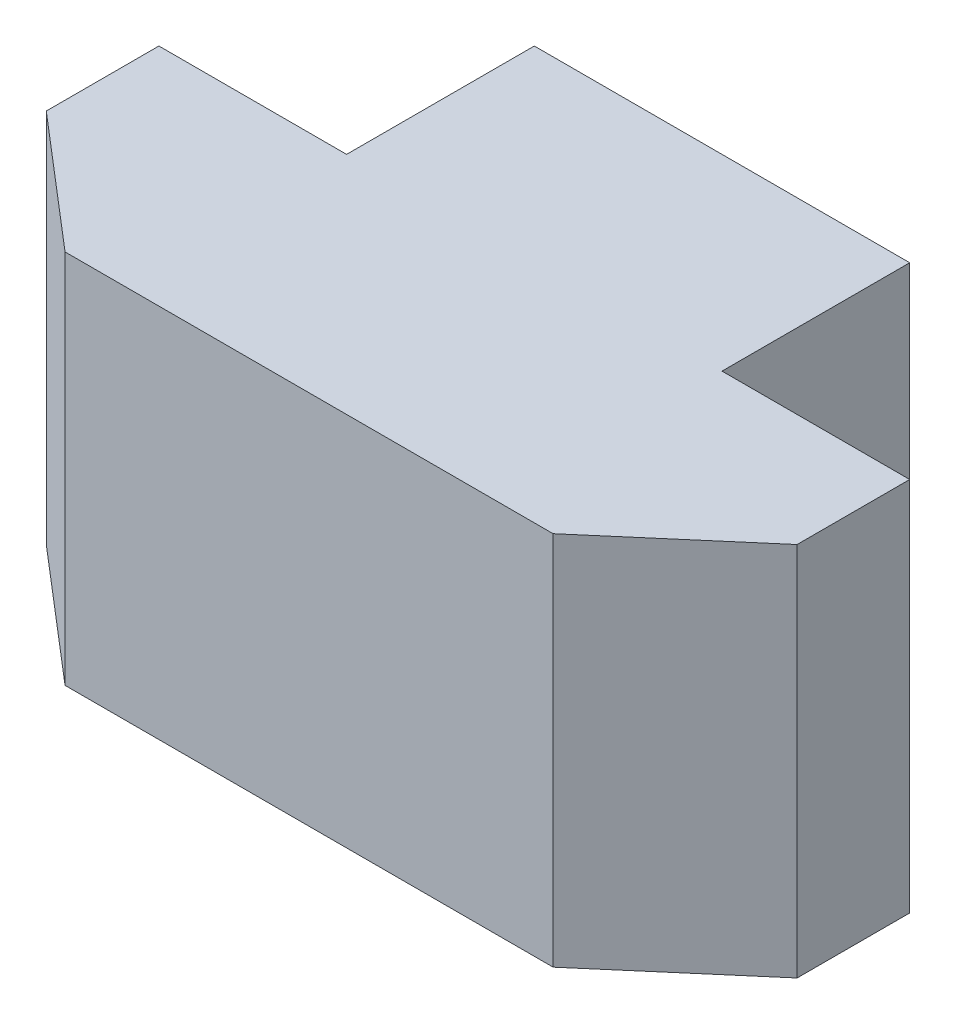
ISO-10303-21;
HEADER;
FILE_DESCRIPTION(('STEP AP214'),'2;1');
FILE_NAME('part.step','',(''),(''),'','','');
FILE_SCHEMA(('AUTOMOTIVE_DESIGN { 1 0 10303 214 1 1 1 1 }'));
ENDSEC;
DATA;
#1=APPLICATION_CONTEXT('core data for automotive mechanical design processes');
#2=APPLICATION_PROTOCOL_DEFINITION('international standard','automotive_design',2000,#1);
#3=PRODUCT_CONTEXT('',#1,'mechanical');
#4=PRODUCT('Part','Part','',(#3));
#5=PRODUCT_RELATED_PRODUCT_CATEGORY('part','',(#4));
#6=PRODUCT_DEFINITION_FORMATION('','',#4);
#7=PRODUCT_DEFINITION_CONTEXT('part definition',#1,'design');
#8=PRODUCT_DEFINITION('design','',#6,#7);
#9=PRODUCT_DEFINITION_SHAPE('','',#8);
#10=(LENGTH_UNIT() NAMED_UNIT(*) SI_UNIT(.MILLI.,.METRE.));
#11=(NAMED_UNIT(*) PLANE_ANGLE_UNIT() SI_UNIT($,.RADIAN.));
#12=(NAMED_UNIT(*) SI_UNIT($,.STERADIAN.) SOLID_ANGLE_UNIT());
#13=UNCERTAINTY_MEASURE_WITH_UNIT(LENGTH_MEASURE(1.E-05),#10,'distance_accuracy_value','');
#14=(GEOMETRIC_REPRESENTATION_CONTEXT(3) GLOBAL_UNCERTAINTY_ASSIGNED_CONTEXT((#13)) GLOBAL_UNIT_ASSIGNED_CONTEXT((#10,
#11,#12)) REPRESENTATION_CONTEXT('',''));
#15=CARTESIAN_POINT('',(0.,0.,0.));
#16=DIRECTION('',(0.,0.,1.));
#17=DIRECTION('',(1.,0.,0.));
#18=AXIS2_PLACEMENT_3D('',#15,#16,#17);
#19=CARTESIAN_POINT('',(-7.67083154247305,5.,-1.25324339707883));
#20=DIRECTION('',(1.,0.,0.));
#21=DIRECTION('',(0.,0.,-1.));
#22=AXIS2_PLACEMENT_3D('',#19,#20,#21);
#23=PLANE('',#22);
#24=DIRECTION('',(0.,0.,1.));
#25=VECTOR('',#24,1.);
#26=CARTESIAN_POINT('',(-7.67083154247305,-5.,-1.25324339707883));
#27=LINE('',#26,#25);
#28=CARTESIAN_POINT('',(-7.67083154247305,-5.,-1.25324339707883));
#29=VERTEX_POINT('',#28);
#30=CARTESIAN_POINT('',(-7.67083154247305,-5.,3.74675660292117));
#31=VERTEX_POINT('',#30);
#32=EDGE_CURVE('E152',#29,#31,#27,.T.);
#33=ORIENTED_EDGE('',*,*,#32,.T.);
#34=DIRECTION('',(0.,-1.,0.));
#35=VECTOR('',#34,1.);
#36=CARTESIAN_POINT('',(-7.67083154247305,5.,3.74675660292117));
#37=LINE('',#36,#35);
#38=CARTESIAN_POINT('',(-7.67083154247305,5.,3.74675660292117));
#39=VERTEX_POINT('',#38);
#40=EDGE_CURVE('E11',#39,#31,#37,.T.);
#41=ORIENTED_EDGE('',*,*,#40,.F.);
#42=DIRECTION('',(0.,0.,1.));
#43=VECTOR('',#42,1.);
#44=CARTESIAN_POINT('',(-7.67083154247305,5.,-1.25324339707883));
#45=LINE('',#44,#43);
#46=CARTESIAN_POINT('',(-7.67083154247305,5.,-1.25324339707883));
#47=VERTEX_POINT('',#46);
#48=EDGE_CURVE('E180',#47,#39,#45,.T.);
#49=ORIENTED_EDGE('',*,*,#48,.F.);
#50=DIRECTION('',(0.,-1.,0.));
#51=VECTOR('',#50,1.);
#52=CARTESIAN_POINT('',(-7.67083154247305,5.,-1.25324339707883));
#53=LINE('',#52,#51);
#54=EDGE_CURVE('E148',#47,#29,#53,.T.);
#55=ORIENTED_EDGE('',*,*,#54,.T.);
#56=EDGE_LOOP('',(#33,#41,#49,#55));
#57=FACE_BOUND('',#56,.T.);
#58=ADVANCED_FACE('F39',(#57),#23,.F.);
#59=CARTESIAN_POINT('',(-7.67083154247305,5.,3.74675660292117));
#60=DIRECTION('',(0.,0.,1.));
#61=DIRECTION('',(1.,0.,0.));
#62=AXIS2_PLACEMENT_3D('',#59,#60,#61);
#63=PLANE('',#62);
#64=DIRECTION('',(-1.,0.,0.));
#65=VECTOR('',#64,1.);
#66=CARTESIAN_POINT('',(-7.67083154247305,-5.,3.74675660292117));
#67=LINE('',#66,#65);
#68=CARTESIAN_POINT('',(-12.670831542473,-5.,3.74675660292117));
#69=VERTEX_POINT('',#68);
#70=EDGE_CURVE('E156',#31,#69,#67,.T.);
#71=ORIENTED_EDGE('',*,*,#70,.T.);
#72=DIRECTION('',(0.,-1.,0.));
#73=VECTOR('',#72,1.);
#74=CARTESIAN_POINT('',(-12.670831542473,5.,3.74675660292117));
#75=LINE('',#74,#73);
#76=CARTESIAN_POINT('',(-12.670831542473,5.,3.74675660292117));
#77=VERTEX_POINT('',#76);
#78=EDGE_CURVE('E48',#77,#69,#75,.T.);
#79=ORIENTED_EDGE('',*,*,#78,.F.);
#80=DIRECTION('',(-1.,0.,0.));
#81=VECTOR('',#80,1.);
#82=CARTESIAN_POINT('',(-7.67083154247305,5.,3.74675660292117));
#83=LINE('',#82,#81);
#84=EDGE_CURVE('E105',#39,#77,#83,.T.);
#85=ORIENTED_EDGE('',*,*,#84,.F.);
#86=ORIENTED_EDGE('',*,*,#40,.T.);
#87=EDGE_LOOP('',(#71,#79,#85,#86));
#88=FACE_BOUND('',#87,.T.);
#89=ADVANCED_FACE('F244',(#88),#63,.F.);
#90=CARTESIAN_POINT('',(-12.670831542473,5.,3.74675660292117));
#91=DIRECTION('',(1.,0.,0.));
#92=DIRECTION('',(0.,0.,-1.));
#93=AXIS2_PLACEMENT_3D('',#90,#91,#92);
#94=PLANE('',#93);
#95=DIRECTION('',(0.,0.,1.));
#96=VECTOR('',#95,1.);
#97=CARTESIAN_POINT('',(-12.670831542473,-5.,3.74675660292117));
#98=LINE('',#97,#96);
#99=CARTESIAN_POINT('',(-12.670831542473,-5.,6.74675660292117));
#100=VERTEX_POINT('',#99);
#101=EDGE_CURVE('E159',#69,#100,#98,.T.);
#102=ORIENTED_EDGE('',*,*,#101,.T.);
#103=DIRECTION('',(0.,-1.,0.));
#104=VECTOR('',#103,1.);
#105=CARTESIAN_POINT('',(-12.670831542473,5.,6.74675660292117));
#106=LINE('',#105,#104);
#107=CARTESIAN_POINT('',(-12.670831542473,5.,6.74675660292117));
#108=VERTEX_POINT('',#107);
#109=EDGE_CURVE('E199',#108,#100,#106,.T.);
#110=ORIENTED_EDGE('',*,*,#109,.F.);
#111=DIRECTION('',(0.,0.,1.));
#112=VECTOR('',#111,1.);
#113=CARTESIAN_POINT('',(-12.670831542473,5.,3.74675660292117));
#114=LINE('',#113,#112);
#115=EDGE_CURVE('E209',#77,#108,#114,.T.);
#116=ORIENTED_EDGE('',*,*,#115,.F.);
#117=ORIENTED_EDGE('',*,*,#78,.T.);
#118=EDGE_LOOP('',(#102,#110,#116,#117));
#119=FACE_BOUND('',#118,.T.);
#120=ADVANCED_FACE('F207',(#119),#94,.F.);
#121=CARTESIAN_POINT('',(-12.670831542473,5.,6.74675660292117));
#122=DIRECTION('',(0.650791373455969,0.,-0.759256602365297));
#123=DIRECTION('',(-0.759256602365297,0.,-0.650791373455969));
#124=AXIS2_PLACEMENT_3D('',#121,#122,#123);
#125=PLANE('',#124);
#126=DIRECTION('',(0.759256602365297,0.,0.650791373455969));
#127=VECTOR('',#126,1.);
#128=CARTESIAN_POINT('',(-12.670831542473,-5.,6.74675660292117));
#129=LINE('',#128,#127);
#130=CARTESIAN_POINT('',(-9.17083154247305,-5.,9.74675660292117));
#131=VERTEX_POINT('',#130);
#132=EDGE_CURVE('E162',#100,#131,#129,.T.);
#133=ORIENTED_EDGE('',*,*,#132,.T.);
#134=DIRECTION('',(0.,-1.,0.));
#135=VECTOR('',#134,1.);
#136=CARTESIAN_POINT('',(-9.17083154247305,5.,9.74675660292117));
#137=LINE('',#136,#135);
#138=CARTESIAN_POINT('',(-9.17083154247305,5.,9.74675660292117));
#139=VERTEX_POINT('',#138);
#140=EDGE_CURVE('E195',#139,#131,#137,.T.);
#141=ORIENTED_EDGE('',*,*,#140,.F.);
#142=DIRECTION('',(0.759256602365297,0.,0.650791373455969));
#143=VECTOR('',#142,1.);
#144=CARTESIAN_POINT('',(-12.670831542473,5.,6.74675660292117));
#145=LINE('',#144,#143);
#146=EDGE_CURVE('E228',#108,#139,#145,.T.);
#147=ORIENTED_EDGE('',*,*,#146,.F.);
#148=ORIENTED_EDGE('',*,*,#109,.T.);
#149=EDGE_LOOP('',(#133,#141,#147,#148));
#150=FACE_BOUND('',#149,.T.);
#151=ADVANCED_FACE('F218',(#150),#125,.F.);
#152=CARTESIAN_POINT('',(-9.17083154247305,5.,9.74675660292117));
#153=DIRECTION('',(0.,0.,-1.));
#154=DIRECTION('',(-1.,0.,0.));
#155=AXIS2_PLACEMENT_3D('',#152,#153,#154);
#156=PLANE('',#155);
#157=DIRECTION('',(1.,0.,0.));
#158=VECTOR('',#157,1.);
#159=CARTESIAN_POINT('',(-9.17083154247305,-5.,9.74675660292117));
#160=LINE('',#159,#158);
#161=CARTESIAN_POINT('',(3.82916845752695,-5.,9.74675660292117));
#162=VERTEX_POINT('',#161);
#163=EDGE_CURVE('E165',#131,#162,#160,.T.);
#164=ORIENTED_EDGE('',*,*,#163,.T.);
#165=DIRECTION('',(0.,-1.,0.));
#166=VECTOR('',#165,1.);
#167=CARTESIAN_POINT('',(3.82916845752695,5.,9.74675660292117));
#168=LINE('',#167,#166);
#169=CARTESIAN_POINT('',(3.82916845752695,5.,9.74675660292117));
#170=VERTEX_POINT('',#169);
#171=EDGE_CURVE('E191',#170,#162,#168,.T.);
#172=ORIENTED_EDGE('',*,*,#171,.F.);
#173=DIRECTION('',(1.,0.,0.));
#174=VECTOR('',#173,1.);
#175=CARTESIAN_POINT('',(-9.17083154247305,5.,9.74675660292117));
#176=LINE('',#175,#174);
#177=EDGE_CURVE('E224',#139,#170,#176,.T.);
#178=ORIENTED_EDGE('',*,*,#177,.F.);
#179=ORIENTED_EDGE('',*,*,#140,.T.);
#180=EDGE_LOOP('',(#164,#172,#178,#179));
#181=FACE_BOUND('',#180,.T.);
#182=ADVANCED_FACE('F222',(#181),#156,.F.);
#183=CARTESIAN_POINT('',(7.32916845752695,5.,6.74675660292117));
#184=DIRECTION('',(-0.650791373455968,0.,-0.759256602365297));
#185=DIRECTION('',(-0.759256602365297,0.,0.650791373455968));
#186=AXIS2_PLACEMENT_3D('',#183,#184,#185);
#187=PLANE('',#186);
#188=DIRECTION('',(0.759256602365297,0.,-0.650791373455968));
#189=VECTOR('',#188,1.);
#190=CARTESIAN_POINT('',(7.32916845752695,-5.,6.74675660292117));
#191=LINE('',#190,#189);
#192=CARTESIAN_POINT('',(7.32916845752695,-5.,6.74675660292117));
#193=VERTEX_POINT('',#192);
#194=EDGE_CURVE('E168',#162,#193,#191,.T.);
#195=ORIENTED_EDGE('',*,*,#194,.T.);
#196=DIRECTION('',(0.,-1.,0.));
#197=VECTOR('',#196,1.);
#198=CARTESIAN_POINT('',(7.32916845752695,5.,6.74675660292117));
#199=LINE('',#198,#197);
#200=CARTESIAN_POINT('',(7.32916845752695,5.,6.74675660292117));
#201=VERTEX_POINT('',#200);
#202=EDGE_CURVE('E187',#201,#193,#199,.T.);
#203=ORIENTED_EDGE('',*,*,#202,.F.);
#204=DIRECTION('',(0.759256602365297,0.,-0.650791373455968));
#205=VECTOR('',#204,1.);
#206=CARTESIAN_POINT('',(7.32916845752695,5.,6.74675660292117));
#207=LINE('',#206,#205);
#208=EDGE_CURVE('E227',#170,#201,#207,.T.);
#209=ORIENTED_EDGE('',*,*,#208,.F.);
#210=ORIENTED_EDGE('',*,*,#171,.T.);
#211=EDGE_LOOP('',(#195,#203,#209,#210));
#212=FACE_BOUND('',#211,.T.);
#213=ADVANCED_FACE('F256',(#212),#187,.F.);
#214=CARTESIAN_POINT('',(7.32916845752695,5.,3.74675660292117));
#215=DIRECTION('',(-1.,0.,0.));
#216=DIRECTION('',(0.,0.,1.));
#217=AXIS2_PLACEMENT_3D('',#214,#215,#216);
#218=PLANE('',#217);
#219=DIRECTION('',(0.,0.,-1.));
#220=VECTOR('',#219,1.);
#221=CARTESIAN_POINT('',(7.32916845752695,-5.,3.74675660292117));
#222=LINE('',#221,#220);
#223=CARTESIAN_POINT('',(7.32916845752695,-5.,3.74675660292117));
#224=VERTEX_POINT('',#223);
#225=EDGE_CURVE('E171',#193,#224,#222,.T.);
#226=ORIENTED_EDGE('',*,*,#225,.T.);
#227=DIRECTION('',(0.,-1.,0.));
#228=VECTOR('',#227,1.);
#229=CARTESIAN_POINT('',(7.32916845752695,5.,3.74675660292117));
#230=LINE('',#229,#228);
#231=CARTESIAN_POINT('',(7.32916845752695,5.,3.74675660292117));
#232=VERTEX_POINT('',#231);
#233=EDGE_CURVE('E141',#232,#224,#230,.T.);
#234=ORIENTED_EDGE('',*,*,#233,.F.);
#235=DIRECTION('',(0.,0.,-1.));
#236=VECTOR('',#235,1.);
#237=CARTESIAN_POINT('',(7.32916845752695,5.,3.74675660292117));
#238=LINE('',#237,#236);
#239=EDGE_CURVE('E130',#201,#232,#238,.T.);
#240=ORIENTED_EDGE('',*,*,#239,.F.);
#241=ORIENTED_EDGE('',*,*,#202,.T.);
#242=EDGE_LOOP('',(#226,#234,#240,#241));
#243=FACE_BOUND('',#242,.T.);
#244=ADVANCED_FACE('F259',(#243),#218,.F.);
#245=CARTESIAN_POINT('',(2.32916845752695,5.,3.74675660292117));
#246=DIRECTION('',(0.,0.,1.));
#247=DIRECTION('',(1.,0.,0.));
#248=AXIS2_PLACEMENT_3D('',#245,#246,#247);
#249=PLANE('',#248);
#250=DIRECTION('',(-1.,0.,0.));
#251=VECTOR('',#250,1.);
#252=CARTESIAN_POINT('',(2.32916845752695,-5.,3.74675660292117));
#253=LINE('',#252,#251);
#254=CARTESIAN_POINT('',(2.32916845752695,-5.,3.74675660292117));
#255=VERTEX_POINT('',#254);
#256=EDGE_CURVE('E139',#224,#255,#253,.T.);
#257=ORIENTED_EDGE('',*,*,#256,.T.);
#258=DIRECTION('',(0.,-1.,0.));
#259=VECTOR('',#258,1.);
#260=CARTESIAN_POINT('',(2.32916845752695,5.,3.74675660292117));
#261=LINE('',#260,#259);
#262=CARTESIAN_POINT('',(2.32916845752695,5.,3.74675660292117));
#263=VERTEX_POINT('',#262);
#264=EDGE_CURVE('E136',#263,#255,#261,.T.);
#265=ORIENTED_EDGE('',*,*,#264,.F.);
#266=DIRECTION('',(-1.,0.,0.));
#267=VECTOR('',#266,1.);
#268=CARTESIAN_POINT('',(2.32916845752695,5.,3.74675660292117));
#269=LINE('',#268,#267);
#270=EDGE_CURVE('E124',#232,#263,#269,.T.);
#271=ORIENTED_EDGE('',*,*,#270,.F.);
#272=ORIENTED_EDGE('',*,*,#233,.T.);
#273=EDGE_LOOP('',(#257,#265,#271,#272));
#274=FACE_BOUND('',#273,.T.);
#275=ADVANCED_FACE('F137',(#274),#249,.F.);
#276=CARTESIAN_POINT('',(2.32916845752695,5.,-1.25324339707883));
#277=DIRECTION('',(-1.,0.,0.));
#278=DIRECTION('',(0.,0.,1.));
#279=AXIS2_PLACEMENT_3D('',#276,#277,#278);
#280=PLANE('',#279);
#281=DIRECTION('',(0.,0.,-1.));
#282=VECTOR('',#281,1.);
#283=CARTESIAN_POINT('',(2.32916845752695,-5.,-1.25324339707883));
#284=LINE('',#283,#282);
#285=CARTESIAN_POINT('',(2.32916845752695,-5.,-1.25324339707883));
#286=VERTEX_POINT('',#285);
#287=EDGE_CURVE('E91',#255,#286,#284,.T.);
#288=ORIENTED_EDGE('',*,*,#287,.T.);
#289=DIRECTION('',(0.,-1.,0.));
#290=VECTOR('',#289,1.);
#291=CARTESIAN_POINT('',(2.32916845752695,5.,-1.25324339707883));
#292=LINE('',#291,#290);
#293=CARTESIAN_POINT('',(2.32916845752695,5.,-1.25324339707883));
#294=VERTEX_POINT('',#293);
#295=EDGE_CURVE('E142',#294,#286,#292,.T.);
#296=ORIENTED_EDGE('',*,*,#295,.F.);
#297=DIRECTION('',(0.,0.,-1.));
#298=VECTOR('',#297,1.);
#299=CARTESIAN_POINT('',(2.32916845752695,5.,-1.25324339707883));
#300=LINE('',#299,#298);
#301=EDGE_CURVE('E128',#263,#294,#300,.T.);
#302=ORIENTED_EDGE('',*,*,#301,.F.);
#303=ORIENTED_EDGE('',*,*,#264,.T.);
#304=EDGE_LOOP('',(#288,#296,#302,#303));
#305=FACE_BOUND('',#304,.T.);
#306=ADVANCED_FACE('F144',(#305),#280,.F.);
#307=CARTESIAN_POINT('',(-7.67083154247305,5.,-1.25324339707883));
#308=DIRECTION('',(0.,0.,1.));
#309=DIRECTION('',(1.,0.,0.));
#310=AXIS2_PLACEMENT_3D('',#307,#308,#309);
#311=PLANE('',#310);
#312=DIRECTION('',(-1.,0.,0.));
#313=VECTOR('',#312,1.);
#314=CARTESIAN_POINT('',(-7.67083154247305,-5.,-1.25324339707883));
#315=LINE('',#314,#313);
#316=EDGE_CURVE('E97',#286,#29,#315,.T.);
#317=ORIENTED_EDGE('',*,*,#316,.T.);
#318=ORIENTED_EDGE('',*,*,#54,.F.);
#319=DIRECTION('',(-1.,0.,0.));
#320=VECTOR('',#319,1.);
#321=CARTESIAN_POINT('',(-7.67083154247305,5.,-1.25324339707883));
#322=LINE('',#321,#320);
#323=EDGE_CURVE('E56',#294,#47,#322,.T.);
#324=ORIENTED_EDGE('',*,*,#323,.F.);
#325=ORIENTED_EDGE('',*,*,#295,.T.);
#326=EDGE_LOOP('',(#317,#318,#324,#325));
#327=FACE_BOUND('',#326,.T.);
#328=ADVANCED_FACE('F268',(#327),#311,.F.);
#329=CARTESIAN_POINT('',(0.,5.,0.));
#330=DIRECTION('',(0.,-1.,0.));
#331=DIRECTION('',(0.,0.,-1.));
#332=AXIS2_PLACEMENT_3D('',#329,#330,#331);
#333=PLANE('',#332);
#334=ORIENTED_EDGE('',*,*,#48,.T.);
#335=ORIENTED_EDGE('',*,*,#84,.T.);
#336=ORIENTED_EDGE('',*,*,#115,.T.);
#337=ORIENTED_EDGE('',*,*,#146,.T.);
#338=ORIENTED_EDGE('',*,*,#177,.T.);
#339=ORIENTED_EDGE('',*,*,#208,.T.);
#340=ORIENTED_EDGE('',*,*,#239,.T.);
#341=ORIENTED_EDGE('',*,*,#270,.T.);
#342=ORIENTED_EDGE('',*,*,#301,.T.);
#343=ORIENTED_EDGE('',*,*,#323,.T.);
#344=EDGE_LOOP('',(#334,#335,#336,#337,#338,#339,#340,#341,#342,#343));
#345=FACE_BOUND('',#344,.T.);
#346=ADVANCED_FACE('F126',(#345),#333,.F.);
#347=CARTESIAN_POINT('',(0.,-5.,0.));
#348=DIRECTION('',(0.,-1.,0.));
#349=DIRECTION('',(0.,0.,-1.));
#350=AXIS2_PLACEMENT_3D('',#347,#348,#349);
#351=PLANE('',#350);
#352=ORIENTED_EDGE('',*,*,#32,.F.);
#353=ORIENTED_EDGE('',*,*,#316,.F.);
#354=ORIENTED_EDGE('',*,*,#287,.F.);
#355=ORIENTED_EDGE('',*,*,#256,.F.);
#356=ORIENTED_EDGE('',*,*,#225,.F.);
#357=ORIENTED_EDGE('',*,*,#194,.F.);
#358=ORIENTED_EDGE('',*,*,#163,.F.);
#359=ORIENTED_EDGE('',*,*,#132,.F.);
#360=ORIENTED_EDGE('',*,*,#101,.F.);
#361=ORIENTED_EDGE('',*,*,#70,.F.);
#362=EDGE_LOOP('',(#352,#353,#354,#355,#356,#357,#358,#359,#360,#361));
#363=FACE_BOUND('',#362,.T.);
#364=ADVANCED_FACE('F213',(#363),#351,.T.);
#365=CLOSED_SHELL('',(#58,#89,#120,#151,#182,#213,#244,#275,#306,#328,#346,#364));
#366=MANIFOLD_SOLID_BREP('B2',#365);
#367=ADVANCED_BREP_SHAPE_REPRESENTATION('',(#18,#366),#14);
#368=SHAPE_DEFINITION_REPRESENTATION(#9,#367);
ENDSEC;
END-ISO-10303-21;
